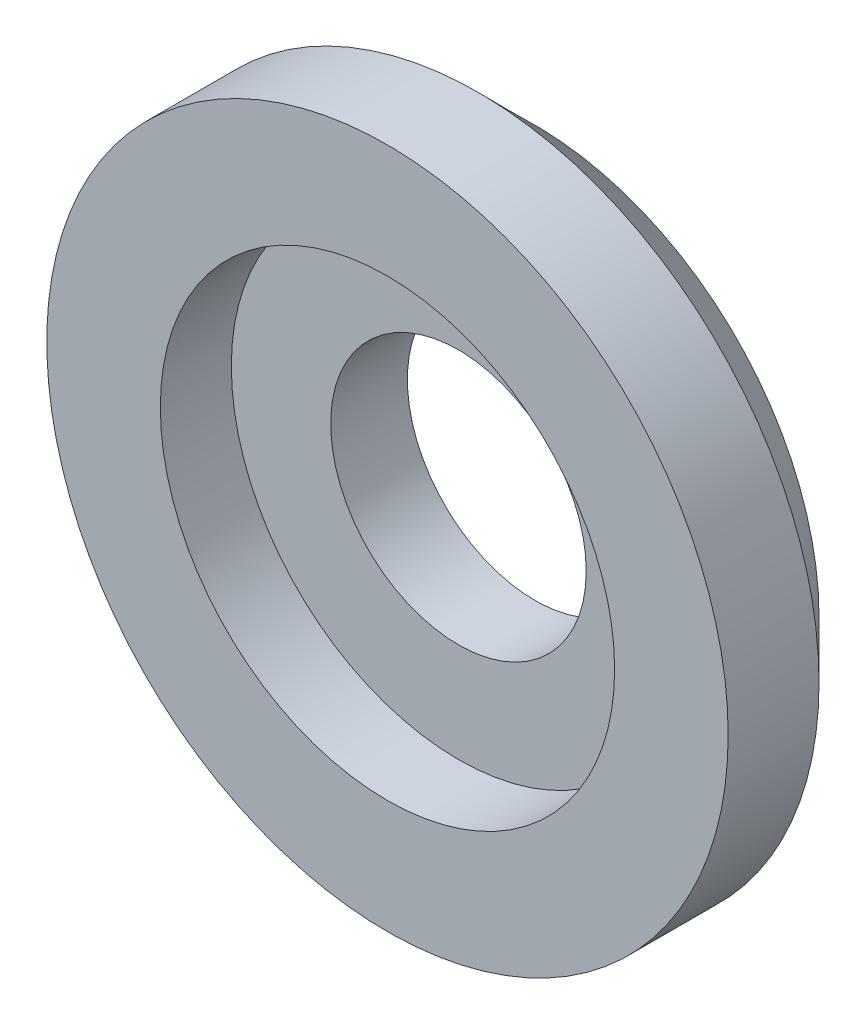
ISO-10303-21;
HEADER;
FILE_DESCRIPTION(('STEP AP214'),'2;1');
FILE_NAME('part.step','',(''),(''),'','','');
FILE_SCHEMA(('AUTOMOTIVE_DESIGN { 1 0 10303 214 1 1 1 1 }'));
ENDSEC;
DATA;
#1=APPLICATION_CONTEXT('core data for automotive mechanical design processes');
#2=APPLICATION_PROTOCOL_DEFINITION('international standard','automotive_design',2000,#1);
#3=PRODUCT_CONTEXT('',#1,'mechanical');
#4=PRODUCT('Part','Part','',(#3));
#5=PRODUCT_RELATED_PRODUCT_CATEGORY('part','',(#4));
#6=PRODUCT_DEFINITION_FORMATION('','',#4);
#7=PRODUCT_DEFINITION_CONTEXT('part definition',#1,'design');
#8=PRODUCT_DEFINITION('design','',#6,#7);
#9=PRODUCT_DEFINITION_SHAPE('','',#8);
#10=(LENGTH_UNIT() NAMED_UNIT(*) SI_UNIT(.MILLI.,.METRE.));
#11=(NAMED_UNIT(*) PLANE_ANGLE_UNIT() SI_UNIT($,.RADIAN.));
#12=(NAMED_UNIT(*) SI_UNIT($,.STERADIAN.) SOLID_ANGLE_UNIT());
#13=UNCERTAINTY_MEASURE_WITH_UNIT(LENGTH_MEASURE(1.E-05),#10,'distance_accuracy_value','');
#14=(GEOMETRIC_REPRESENTATION_CONTEXT(3) GLOBAL_UNCERTAINTY_ASSIGNED_CONTEXT((#13)) GLOBAL_UNIT_ASSIGNED_CONTEXT((#10,
#11,#12)) REPRESENTATION_CONTEXT('',''));
#15=CARTESIAN_POINT('',(0.,0.,0.));
#16=DIRECTION('',(0.,0.,1.));
#17=DIRECTION('',(1.,0.,0.));
#18=AXIS2_PLACEMENT_3D('',#15,#16,#17);
#19=CARTESIAN_POINT('',(0.,0.,5.2));
#20=DIRECTION('',(0.,0.,-1.));
#21=DIRECTION('',(-1.,0.,0.));
#22=AXIS2_PLACEMENT_3D('',#19,#20,#21);
#23=CYLINDRICAL_SURFACE('',#22,12.);
#24=CARTESIAN_POINT('',(0.,0.,2.));
#25=DIRECTION('',(0.,0.,1.));
#26=DIRECTION('',(1.,0.,0.));
#27=AXIS2_PLACEMENT_3D('',#24,#25,#26);
#28=CIRCLE('',#27,12.);
#29=CARTESIAN_POINT('',(12.,0.,2.));
#30=VERTEX_POINT('',#29);
#31=EDGE_CURVE('E37',#30,#30,#28,.T.);
#32=ORIENTED_EDGE('',*,*,#31,.T.);
#33=EDGE_LOOP('',(#32));
#34=FACE_BOUND('',#33,.T.);
#35=CARTESIAN_POINT('',(0.,0.,5.2));
#36=DIRECTION('',(0.,0.,1.));
#37=DIRECTION('',(1.,0.,0.));
#38=AXIS2_PLACEMENT_3D('',#35,#36,#37);
#39=CIRCLE('',#38,12.);
#40=CARTESIAN_POINT('',(12.,0.,5.2));
#41=VERTEX_POINT('',#40);
#42=EDGE_CURVE('E41',#41,#41,#39,.T.);
#43=ORIENTED_EDGE('',*,*,#42,.F.);
#44=EDGE_LOOP('',(#43));
#45=FACE_BOUND('',#44,.T.);
#46=ADVANCED_FACE('F30',(#34,#45),#23,.T.);
#47=CARTESIAN_POINT('',(0.,0.,5.2));
#48=DIRECTION('',(0.,0.,1.));
#49=DIRECTION('',(1.,0.,0.));
#50=AXIS2_PLACEMENT_3D('',#47,#48,#49);
#51=PLANE('',#50);
#52=CARTESIAN_POINT('',(0.,0.,5.2));
#53=DIRECTION('',(0.,0.,1.));
#54=DIRECTION('',(1.,0.,0.));
#55=AXIS2_PLACEMENT_3D('',#52,#53,#54);
#56=CIRCLE('',#55,8.);
#57=CARTESIAN_POINT('',(8.,0.,5.2));
#58=VERTEX_POINT('',#57);
#59=EDGE_CURVE('E48',#58,#58,#56,.T.);
#60=ORIENTED_EDGE('',*,*,#59,.F.);
#61=EDGE_LOOP('',(#60));
#62=FACE_BOUND('',#61,.T.);
#63=ORIENTED_EDGE('',*,*,#42,.T.);
#64=EDGE_LOOP('',(#63));
#65=FACE_BOUND('',#64,.T.);
#66=ADVANCED_FACE('F76',(#62,#65),#51,.T.);
#67=CARTESIAN_POINT('',(0.,0.,0.));
#68=DIRECTION('',(0.,0.,1.));
#69=DIRECTION('',(1.,0.,0.));
#70=AXIS2_PLACEMENT_3D('',#67,#68,#69);
#71=PLANE('',#70);
#72=CARTESIAN_POINT('',(0.,0.,0.));
#73=DIRECTION('',(0.,0.,1.));
#74=DIRECTION('',(1.,0.,0.));
#75=AXIS2_PLACEMENT_3D('',#72,#73,#74);
#76=CIRCLE('',#75,10.);
#77=CARTESIAN_POINT('',(10.,0.,0.));
#78=VERTEX_POINT('',#77);
#79=EDGE_CURVE('E10',#78,#78,#76,.F.);
#80=ORIENTED_EDGE('',*,*,#79,.T.);
#81=EDGE_LOOP('',(#80));
#82=FACE_BOUND('',#81,.T.);
#83=CARTESIAN_POINT('',(0.,0.,0.));
#84=DIRECTION('',(0.,0.,1.));
#85=DIRECTION('',(1.,0.,0.));
#86=AXIS2_PLACEMENT_3D('',#83,#84,#85);
#87=CIRCLE('',#86,4.5);
#88=CARTESIAN_POINT('',(4.5,0.,0.));
#89=VERTEX_POINT('',#88);
#90=EDGE_CURVE('E51',#89,#89,#87,.T.);
#91=ORIENTED_EDGE('',*,*,#90,.T.);
#92=EDGE_LOOP('',(#91));
#93=FACE_BOUND('',#92,.T.);
#94=ADVANCED_FACE('F72',(#82,#93),#71,.F.);
#95=CARTESIAN_POINT('',(0.,0.,2.7));
#96=DIRECTION('',(0.,0.,1.));
#97=DIRECTION('',(1.,0.,0.));
#98=AXIS2_PLACEMENT_3D('',#95,#96,#97);
#99=CYLINDRICAL_SURFACE('',#98,8.);
#100=CARTESIAN_POINT('',(0.,0.,2.7));
#101=DIRECTION('',(0.,0.,1.));
#102=DIRECTION('',(1.,0.,0.));
#103=AXIS2_PLACEMENT_3D('',#100,#101,#102);
#104=CIRCLE('',#103,8.);
#105=CARTESIAN_POINT('',(8.,0.,2.7));
#106=VERTEX_POINT('',#105);
#107=EDGE_CURVE('E45',#106,#106,#104,.T.);
#108=ORIENTED_EDGE('',*,*,#107,.F.);
#109=EDGE_LOOP('',(#108));
#110=FACE_BOUND('',#109,.T.);
#111=ORIENTED_EDGE('',*,*,#59,.T.);
#112=EDGE_LOOP('',(#111));
#113=FACE_BOUND('',#112,.T.);
#114=ADVANCED_FACE('F66',(#110,#113),#99,.F.);
#115=CARTESIAN_POINT('',(0.,0.,2.7));
#116=DIRECTION('',(0.,0.,1.));
#117=DIRECTION('',(1.,0.,0.));
#118=AXIS2_PLACEMENT_3D('',#115,#116,#117);
#119=PLANE('',#118);
#120=CARTESIAN_POINT('',(0.,0.,2.7));
#121=DIRECTION('',(0.,0.,1.));
#122=DIRECTION('',(1.,0.,0.));
#123=AXIS2_PLACEMENT_3D('',#120,#121,#122);
#124=CIRCLE('',#123,4.5);
#125=CARTESIAN_POINT('',(4.5,0.,2.7));
#126=VERTEX_POINT('',#125);
#127=EDGE_CURVE('E56',#126,#126,#124,.T.);
#128=ORIENTED_EDGE('',*,*,#127,.F.);
#129=EDGE_LOOP('',(#128));
#130=FACE_BOUND('',#129,.T.);
#131=ORIENTED_EDGE('',*,*,#107,.T.);
#132=EDGE_LOOP('',(#131));
#133=FACE_BOUND('',#132,.T.);
#134=ADVANCED_FACE('F63',(#130,#133),#119,.T.);
#135=CARTESIAN_POINT('',(0.,0.,-9.9));
#136=DIRECTION('',(0.,0.,1.));
#137=DIRECTION('',(1.,0.,0.));
#138=AXIS2_PLACEMENT_3D('',#135,#136,#137);
#139=CYLINDRICAL_SURFACE('',#138,4.5);
#140=ORIENTED_EDGE('',*,*,#127,.T.);
#141=EDGE_LOOP('',(#140));
#142=FACE_BOUND('',#141,.T.);
#143=ORIENTED_EDGE('',*,*,#90,.F.);
#144=EDGE_LOOP('',(#143));
#145=FACE_BOUND('',#144,.T.);
#146=ADVANCED_FACE('F60',(#142,#145),#139,.F.);
#147=CARTESIAN_POINT('',(0.,0.,2.));
#148=DIRECTION('',(0.,0.,1.));
#149=DIRECTION('',(1.,0.,0.));
#150=AXIS2_PLACEMENT_3D('',#147,#148,#149);
#151=CONICAL_SURFACE('',#150,12.,0.78539816339745);
#152=ORIENTED_EDGE('',*,*,#79,.F.);
#153=EDGE_LOOP('',(#152));
#154=FACE_BOUND('',#153,.T.);
#155=ORIENTED_EDGE('',*,*,#31,.F.);
#156=EDGE_LOOP('',(#155));
#157=FACE_BOUND('',#156,.T.);
#158=ADVANCED_FACE('F32',(#154,#157),#151,.T.);
#159=CLOSED_SHELL('',(#46,#66,#94,#114,#134,#146,#158));
#160=MANIFOLD_SOLID_BREP('B2',#159);
#161=ADVANCED_BREP_SHAPE_REPRESENTATION('',(#18,#160),#14);
#162=SHAPE_DEFINITION_REPRESENTATION(#9,#161);
ENDSEC;
END-ISO-10303-21;
